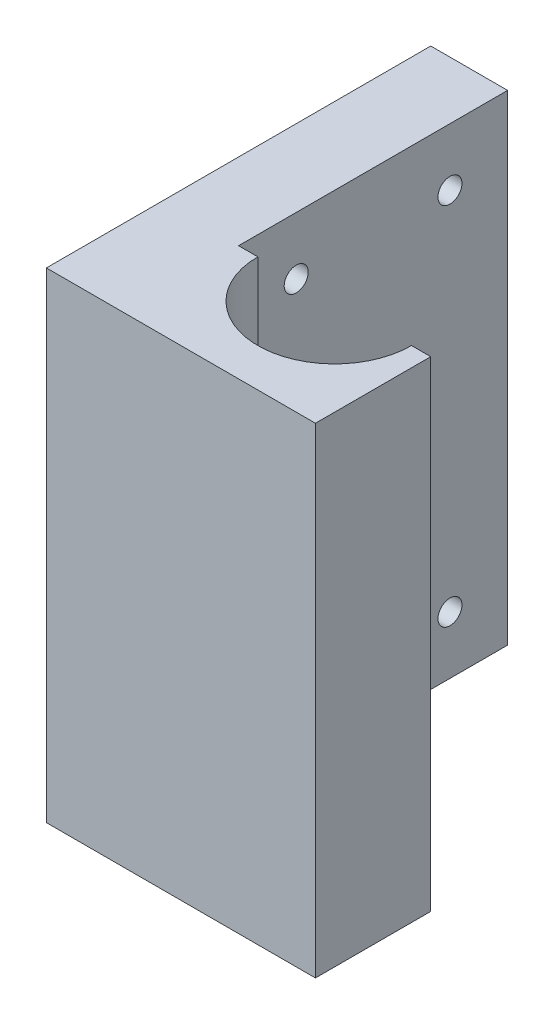
ISO-10303-21;
HEADER;
FILE_DESCRIPTION(('STEP AP214'),'2;1');
FILE_NAME('part.step','',(''),(''),'','','');
FILE_SCHEMA(('AUTOMOTIVE_DESIGN { 1 0 10303 214 1 1 1 1 }'));
ENDSEC;
DATA;
#1=APPLICATION_CONTEXT('core data for automotive mechanical design processes');
#2=APPLICATION_PROTOCOL_DEFINITION('international standard','automotive_design',2000,#1);
#3=PRODUCT_CONTEXT('',#1,'mechanical');
#4=PRODUCT('Part','Part','',(#3));
#5=PRODUCT_RELATED_PRODUCT_CATEGORY('part','',(#4));
#6=PRODUCT_DEFINITION_FORMATION('','',#4);
#7=PRODUCT_DEFINITION_CONTEXT('part definition',#1,'design');
#8=PRODUCT_DEFINITION('design','',#6,#7);
#9=PRODUCT_DEFINITION_SHAPE('','',#8);
#10=(LENGTH_UNIT() NAMED_UNIT(*) SI_UNIT(.MILLI.,.METRE.));
#11=(NAMED_UNIT(*) PLANE_ANGLE_UNIT() SI_UNIT($,.RADIAN.));
#12=(NAMED_UNIT(*) SI_UNIT($,.STERADIAN.) SOLID_ANGLE_UNIT());
#13=UNCERTAINTY_MEASURE_WITH_UNIT(LENGTH_MEASURE(1.E-05),#10,'distance_accuracy_value','');
#14=(GEOMETRIC_REPRESENTATION_CONTEXT(3) GLOBAL_UNCERTAINTY_ASSIGNED_CONTEXT((#13)) GLOBAL_UNIT_ASSIGNED_CONTEXT((#10,
#11,#12)) REPRESENTATION_CONTEXT('',''));
#15=CARTESIAN_POINT('',(0.,0.,0.));
#16=DIRECTION('',(0.,0.,1.));
#17=DIRECTION('',(1.,0.,0.));
#18=AXIS2_PLACEMENT_3D('',#15,#16,#17);
#19=CARTESIAN_POINT('',(2.,50.,0.));
#20=DIRECTION('',(0.,0.,1.));
#21=DIRECTION('',(1.,0.,0.));
#22=AXIS2_PLACEMENT_3D('',#19,#20,#21);
#23=PLANE('',#22);
#24=DIRECTION('',(-1.,0.,0.));
#25=VECTOR('',#24,1.);
#26=CARTESIAN_POINT('',(2.,0.,0.));
#27=LINE('',#26,#25);
#28=CARTESIAN_POINT('',(2.,0.,0.));
#29=VERTEX_POINT('',#28);
#30=CARTESIAN_POINT('',(0.,0.,0.));
#31=VERTEX_POINT('',#30);
#32=EDGE_CURVE('E144',#29,#31,#27,.T.);
#33=ORIENTED_EDGE('',*,*,#32,.T.);
#34=DIRECTION('',(0.,-1.,0.));
#35=VECTOR('',#34,1.);
#36=CARTESIAN_POINT('',(0.,50.,0.));
#37=LINE('',#36,#35);
#38=CARTESIAN_POINT('',(0.,50.,0.));
#39=VERTEX_POINT('',#38);
#40=EDGE_CURVE('E11',#39,#31,#37,.T.);
#41=ORIENTED_EDGE('',*,*,#40,.F.);
#42=DIRECTION('',(-1.,0.,0.));
#43=VECTOR('',#42,1.);
#44=CARTESIAN_POINT('',(2.,50.,0.));
#45=LINE('',#44,#43);
#46=CARTESIAN_POINT('',(2.,50.,0.));
#47=VERTEX_POINT('',#46);
#48=EDGE_CURVE('E167',#47,#39,#45,.T.);
#49=ORIENTED_EDGE('',*,*,#48,.F.);
#50=DIRECTION('',(0.,-1.,0.));
#51=VECTOR('',#50,1.);
#52=CARTESIAN_POINT('',(2.,50.,0.));
#53=LINE('',#52,#51);
#54=EDGE_CURVE('E140',#47,#29,#53,.T.);
#55=ORIENTED_EDGE('',*,*,#54,.T.);
#56=EDGE_LOOP('',(#33,#41,#49,#55));
#57=FACE_BOUND('',#56,.T.);
#58=ADVANCED_FACE('F43',(#57),#23,.F.);
#59=CARTESIAN_POINT('',(0.,50.,0.));
#60=DIRECTION('',(-1.,0.,0.));
#61=DIRECTION('',(0.,0.,1.));
#62=AXIS2_PLACEMENT_3D('',#59,#60,#61);
#63=PLANE('',#62);
#64=CARTESIAN_POINT('',(0.,44.,-22.));
#65=DIRECTION('',(1.,0.,0.));
#66=DIRECTION('',(0.,0.,-1.));
#67=AXIS2_PLACEMENT_3D('',#64,#65,#66);
#68=CIRCLE('',#67,1.24999999999999);
#69=CARTESIAN_POINT('',(0.,44.,-23.25));
#70=VERTEX_POINT('',#69);
#71=EDGE_CURVE('E238',#70,#70,#68,.T.);
#72=ORIENTED_EDGE('',*,*,#71,.F.);
#73=EDGE_LOOP('',(#72));
#74=FACE_BOUND('',#73,.T.);
#75=CARTESIAN_POINT('',(0.,44.,-6.));
#76=DIRECTION('',(1.,0.,0.));
#77=DIRECTION('',(0.,0.,-1.));
#78=AXIS2_PLACEMENT_3D('',#75,#76,#77);
#79=CIRCLE('',#78,1.24999999999999);
#80=CARTESIAN_POINT('',(0.,44.,-7.24999999999999));
#81=VERTEX_POINT('',#80);
#82=EDGE_CURVE('E230',#81,#81,#79,.T.);
#83=ORIENTED_EDGE('',*,*,#82,.F.);
#84=EDGE_LOOP('',(#83));
#85=FACE_BOUND('',#84,.T.);
#86=CARTESIAN_POINT('',(0.,6.,-6.));
#87=DIRECTION('',(1.,0.,0.));
#88=DIRECTION('',(0.,0.,-1.));
#89=AXIS2_PLACEMENT_3D('',#86,#87,#88);
#90=CIRCLE('',#89,1.24999999999999);
#91=CARTESIAN_POINT('',(0.,6.,-7.24999999999999));
#92=VERTEX_POINT('',#91);
#93=EDGE_CURVE('E222',#92,#92,#90,.T.);
#94=ORIENTED_EDGE('',*,*,#93,.F.);
#95=EDGE_LOOP('',(#94));
#96=FACE_BOUND('',#95,.T.);
#97=CARTESIAN_POINT('',(0.,6.,-22.));
#98=DIRECTION('',(1.,0.,0.));
#99=DIRECTION('',(0.,0.,-1.));
#100=AXIS2_PLACEMENT_3D('',#97,#98,#99);
#101=CIRCLE('',#100,1.24999999999999);
#102=CARTESIAN_POINT('',(0.,6.,-23.25));
#103=VERTEX_POINT('',#102);
#104=EDGE_CURVE('E214',#103,#103,#101,.T.);
#105=ORIENTED_EDGE('',*,*,#104,.F.);
#106=EDGE_LOOP('',(#105));
#107=FACE_BOUND('',#106,.T.);
#108=DIRECTION('',(0.,0.,-1.));
#109=VECTOR('',#108,1.);
#110=CARTESIAN_POINT('',(0.,0.,0.));
#111=LINE('',#110,#109);
#112=CARTESIAN_POINT('',(0.,0.,-28.));
#113=VERTEX_POINT('',#112);
#114=EDGE_CURVE('E148',#31,#113,#111,.T.);
#115=ORIENTED_EDGE('',*,*,#114,.T.);
#116=DIRECTION('',(0.,-1.,0.));
#117=VECTOR('',#116,1.);
#118=CARTESIAN_POINT('',(0.,50.,-28.));
#119=LINE('',#118,#117);
#120=CARTESIAN_POINT('',(0.,50.,-28.));
#121=VERTEX_POINT('',#120);
#122=EDGE_CURVE('E52',#121,#113,#119,.T.);
#123=ORIENTED_EDGE('',*,*,#122,.F.);
#124=DIRECTION('',(0.,0.,-1.));
#125=VECTOR('',#124,1.);
#126=CARTESIAN_POINT('',(0.,50.,0.));
#127=LINE('',#126,#125);
#128=EDGE_CURVE('E103',#39,#121,#127,.T.);
#129=ORIENTED_EDGE('',*,*,#128,.F.);
#130=ORIENTED_EDGE('',*,*,#40,.T.);
#131=EDGE_LOOP('',(#115,#123,#129,#130));
#132=FACE_BOUND('',#131,.T.);
#133=ADVANCED_FACE('F245',(#74,#85,#96,#107,#132),#63,.F.);
#134=CARTESIAN_POINT('',(0.,50.,-28.));
#135=DIRECTION('',(0.,0.,1.));
#136=DIRECTION('',(1.,0.,0.));
#137=AXIS2_PLACEMENT_3D('',#134,#135,#136);
#138=PLANE('',#137);
#139=DIRECTION('',(-1.,0.,0.));
#140=VECTOR('',#139,1.);
#141=CARTESIAN_POINT('',(0.,0.,-28.));
#142=LINE('',#141,#140);
#143=CARTESIAN_POINT('',(-8.00000000000001,0.,-28.));
#144=VERTEX_POINT('',#143);
#145=EDGE_CURVE('E152',#113,#144,#142,.T.);
#146=ORIENTED_EDGE('',*,*,#145,.T.);
#147=DIRECTION('',(0.,-1.,0.));
#148=VECTOR('',#147,1.);
#149=CARTESIAN_POINT('',(-8.00000000000001,50.,-28.));
#150=LINE('',#149,#148);
#151=CARTESIAN_POINT('',(-8.00000000000001,50.,-28.));
#152=VERTEX_POINT('',#151);
#153=EDGE_CURVE('E178',#152,#144,#150,.T.);
#154=ORIENTED_EDGE('',*,*,#153,.F.);
#155=DIRECTION('',(-1.,0.,0.));
#156=VECTOR('',#155,1.);
#157=CARTESIAN_POINT('',(0.,50.,-28.));
#158=LINE('',#157,#156);
#159=EDGE_CURVE('E188',#121,#152,#158,.T.);
#160=ORIENTED_EDGE('',*,*,#159,.F.);
#161=ORIENTED_EDGE('',*,*,#122,.T.);
#162=EDGE_LOOP('',(#146,#154,#160,#161));
#163=FACE_BOUND('',#162,.T.);
#164=ADVANCED_FACE('F186',(#163),#138,.F.);
#165=CARTESIAN_POINT('',(-8.00000000000001,50.,-28.));
#166=DIRECTION('',(1.,0.,0.));
#167=DIRECTION('',(0.,0.,-1.));
#168=AXIS2_PLACEMENT_3D('',#165,#166,#167);
#169=PLANE('',#168);
#170=CARTESIAN_POINT('',(-8.00000000000001,44.,-22.));
#171=DIRECTION('',(1.,0.,0.));
#172=DIRECTION('',(0.,0.,-1.));
#173=AXIS2_PLACEMENT_3D('',#170,#171,#172);
#174=CIRCLE('',#173,1.25);
#175=CARTESIAN_POINT('',(-8.00000000000001,44.,-23.25));
#176=VERTEX_POINT('',#175);
#177=EDGE_CURVE('E234',#176,#176,#174,.T.);
#178=ORIENTED_EDGE('',*,*,#177,.T.);
#179=EDGE_LOOP('',(#178));
#180=FACE_BOUND('',#179,.T.);
#181=CARTESIAN_POINT('',(-8.00000000000001,44.,-6.));
#182=DIRECTION('',(1.,0.,0.));
#183=DIRECTION('',(0.,0.,-1.));
#184=AXIS2_PLACEMENT_3D('',#181,#182,#183);
#185=CIRCLE('',#184,1.25);
#186=CARTESIAN_POINT('',(-8.00000000000001,44.,-7.25));
#187=VERTEX_POINT('',#186);
#188=EDGE_CURVE('E226',#187,#187,#185,.T.);
#189=ORIENTED_EDGE('',*,*,#188,.T.);
#190=EDGE_LOOP('',(#189));
#191=FACE_BOUND('',#190,.T.);
#192=CARTESIAN_POINT('',(-8.00000000000001,6.,-6.));
#193=DIRECTION('',(1.,0.,0.));
#194=DIRECTION('',(0.,0.,-1.));
#195=AXIS2_PLACEMENT_3D('',#192,#193,#194);
#196=CIRCLE('',#195,1.25);
#197=CARTESIAN_POINT('',(-8.00000000000001,6.,-7.25));
#198=VERTEX_POINT('',#197);
#199=EDGE_CURVE('E218',#198,#198,#196,.T.);
#200=ORIENTED_EDGE('',*,*,#199,.T.);
#201=EDGE_LOOP('',(#200));
#202=FACE_BOUND('',#201,.T.);
#203=CARTESIAN_POINT('',(-8.00000000000001,6.,-22.));
#204=DIRECTION('',(1.,0.,0.));
#205=DIRECTION('',(0.,0.,-1.));
#206=AXIS2_PLACEMENT_3D('',#203,#204,#205);
#207=CIRCLE('',#206,1.25);
#208=CARTESIAN_POINT('',(-8.00000000000001,6.,-23.25));
#209=VERTEX_POINT('',#208);
#210=EDGE_CURVE('E149',#209,#209,#207,.T.);
#211=ORIENTED_EDGE('',*,*,#210,.T.);
#212=EDGE_LOOP('',(#211));
#213=FACE_BOUND('',#212,.T.);
#214=DIRECTION('',(0.,0.,1.));
#215=VECTOR('',#214,1.);
#216=CARTESIAN_POINT('',(-8.00000000000001,0.,-28.));
#217=LINE('',#216,#215);
#218=CARTESIAN_POINT('',(-8.,0.,12.));
#219=VERTEX_POINT('',#218);
#220=EDGE_CURVE('E155',#144,#219,#217,.T.);
#221=ORIENTED_EDGE('',*,*,#220,.T.);
#222=DIRECTION('',(0.,-1.,0.));
#223=VECTOR('',#222,1.);
#224=CARTESIAN_POINT('',(-8.,50.,12.));
#225=LINE('',#224,#223);
#226=CARTESIAN_POINT('',(-8.,50.,12.));
#227=VERTEX_POINT('',#226);
#228=EDGE_CURVE('E174',#227,#219,#225,.T.);
#229=ORIENTED_EDGE('',*,*,#228,.F.);
#230=DIRECTION('',(0.,0.,1.));
#231=VECTOR('',#230,1.);
#232=CARTESIAN_POINT('',(-8.00000000000001,50.,-28.));
#233=LINE('',#232,#231);
#234=EDGE_CURVE('E201',#152,#227,#233,.T.);
#235=ORIENTED_EDGE('',*,*,#234,.F.);
#236=ORIENTED_EDGE('',*,*,#153,.T.);
#237=EDGE_LOOP('',(#221,#229,#235,#236));
#238=FACE_BOUND('',#237,.T.);
#239=ADVANCED_FACE('F196',(#180,#191,#202,#213,#238),#169,.F.);
#240=CARTESIAN_POINT('',(-8.,50.,12.));
#241=DIRECTION('',(0.,0.,-1.));
#242=DIRECTION('',(-1.,0.,0.));
#243=AXIS2_PLACEMENT_3D('',#240,#241,#242);
#244=PLANE('',#243);
#245=DIRECTION('',(1.,0.,0.));
#246=VECTOR('',#245,1.);
#247=CARTESIAN_POINT('',(-8.,0.,12.));
#248=LINE('',#247,#246);
#249=CARTESIAN_POINT('',(20.,0.,12.));
#250=VERTEX_POINT('',#249);
#251=EDGE_CURVE('E158',#219,#250,#248,.T.);
#252=ORIENTED_EDGE('',*,*,#251,.T.);
#253=DIRECTION('',(0.,-1.,0.));
#254=VECTOR('',#253,1.);
#255=CARTESIAN_POINT('',(20.,50.,12.));
#256=LINE('',#255,#254);
#257=CARTESIAN_POINT('',(20.,50.,12.));
#258=VERTEX_POINT('',#257);
#259=EDGE_CURVE('E133',#258,#250,#256,.T.);
#260=ORIENTED_EDGE('',*,*,#259,.F.);
#261=DIRECTION('',(1.,0.,0.));
#262=VECTOR('',#261,1.);
#263=CARTESIAN_POINT('',(-8.,50.,12.));
#264=LINE('',#263,#262);
#265=EDGE_CURVE('E122',#227,#258,#264,.T.);
#266=ORIENTED_EDGE('',*,*,#265,.F.);
#267=ORIENTED_EDGE('',*,*,#228,.T.);
#268=EDGE_LOOP('',(#252,#260,#266,#267));
#269=FACE_BOUND('',#268,.T.);
#270=ADVANCED_FACE('F199',(#269),#244,.F.);
#271=CARTESIAN_POINT('',(20.,50.,12.));
#272=DIRECTION('',(-1.,0.,0.));
#273=DIRECTION('',(0.,0.,1.));
#274=AXIS2_PLACEMENT_3D('',#271,#272,#273);
#275=PLANE('',#274);
#276=DIRECTION('',(0.,0.,-1.));
#277=VECTOR('',#276,1.);
#278=CARTESIAN_POINT('',(20.,0.,12.));
#279=LINE('',#278,#277);
#280=CARTESIAN_POINT('',(20.,0.,0.));
#281=VERTEX_POINT('',#280);
#282=EDGE_CURVE('E131',#250,#281,#279,.T.);
#283=ORIENTED_EDGE('',*,*,#282,.T.);
#284=DIRECTION('',(0.,-1.,0.));
#285=VECTOR('',#284,1.);
#286=CARTESIAN_POINT('',(20.,50.,0.));
#287=LINE('',#286,#285);
#288=CARTESIAN_POINT('',(20.,50.,0.));
#289=VERTEX_POINT('',#288);
#290=EDGE_CURVE('E128',#289,#281,#287,.T.);
#291=ORIENTED_EDGE('',*,*,#290,.F.);
#292=DIRECTION('',(0.,0.,-1.));
#293=VECTOR('',#292,1.);
#294=CARTESIAN_POINT('',(20.,50.,12.));
#295=LINE('',#294,#293);
#296=EDGE_CURVE('E116',#258,#289,#295,.T.);
#297=ORIENTED_EDGE('',*,*,#296,.F.);
#298=ORIENTED_EDGE('',*,*,#259,.T.);
#299=EDGE_LOOP('',(#283,#291,#297,#298));
#300=FACE_BOUND('',#299,.T.);
#301=ADVANCED_FACE('F129',(#300),#275,.F.);
#302=CARTESIAN_POINT('',(20.,50.,0.));
#303=DIRECTION('',(0.,0.,1.));
#304=DIRECTION('',(1.,0.,0.));
#305=AXIS2_PLACEMENT_3D('',#302,#303,#304);
#306=PLANE('',#305);
#307=DIRECTION('',(-1.,0.,0.));
#308=VECTOR('',#307,1.);
#309=CARTESIAN_POINT('',(20.,0.,0.));
#310=LINE('',#309,#308);
#311=CARTESIAN_POINT('',(18.,0.,0.));
#312=VERTEX_POINT('',#311);
#313=EDGE_CURVE('E89',#281,#312,#310,.T.);
#314=ORIENTED_EDGE('',*,*,#313,.T.);
#315=DIRECTION('',(0.,-1.,0.));
#316=VECTOR('',#315,1.);
#317=CARTESIAN_POINT('',(18.,50.,0.));
#318=LINE('',#317,#316);
#319=CARTESIAN_POINT('',(18.,50.,0.));
#320=VERTEX_POINT('',#319);
#321=EDGE_CURVE('E134',#320,#312,#318,.T.);
#322=ORIENTED_EDGE('',*,*,#321,.F.);
#323=DIRECTION('',(-1.,0.,0.));
#324=VECTOR('',#323,1.);
#325=CARTESIAN_POINT('',(20.,50.,0.));
#326=LINE('',#325,#324);
#327=EDGE_CURVE('E120',#289,#320,#326,.T.);
#328=ORIENTED_EDGE('',*,*,#327,.F.);
#329=ORIENTED_EDGE('',*,*,#290,.T.);
#330=EDGE_LOOP('',(#314,#322,#328,#329));
#331=FACE_BOUND('',#330,.T.);
#332=ADVANCED_FACE('F136',(#331),#306,.F.);
#333=CARTESIAN_POINT('',(10.,50.,0.));
#334=DIRECTION('',(0.,-1.,0.));
#335=DIRECTION('',(0.,0.,-1.));
#336=AXIS2_PLACEMENT_3D('',#333,#334,#335);
#337=CYLINDRICAL_SURFACE('',#336,8.);
#338=CARTESIAN_POINT('',(10.,0.,0.));
#339=DIRECTION('',(0.,-1.,0.));
#340=DIRECTION('',(0.,0.,1.));
#341=AXIS2_PLACEMENT_3D('',#338,#339,#340);
#342=CIRCLE('',#341,8.);
#343=EDGE_CURVE('E95',#312,#29,#342,.T.);
#344=ORIENTED_EDGE('',*,*,#343,.T.);
#345=ORIENTED_EDGE('',*,*,#54,.F.);
#346=CARTESIAN_POINT('',(10.,50.,0.));
#347=DIRECTION('',(0.,-1.,0.));
#348=DIRECTION('',(0.,0.,1.));
#349=AXIS2_PLACEMENT_3D('',#346,#347,#348);
#350=CIRCLE('',#349,8.);
#351=EDGE_CURVE('E60',#320,#47,#350,.T.);
#352=ORIENTED_EDGE('',*,*,#351,.F.);
#353=ORIENTED_EDGE('',*,*,#321,.T.);
#354=EDGE_LOOP('',(#344,#345,#352,#353));
#355=FACE_BOUND('',#354,.T.);
#356=ADVANCED_FACE('F256',(#355),#337,.F.);
#357=CARTESIAN_POINT('',(10.,50.,0.));
#358=DIRECTION('',(0.,1.,0.));
#359=DIRECTION('',(0.,0.,1.));
#360=AXIS2_PLACEMENT_3D('',#357,#358,#359);
#361=PLANE('',#360);
#362=ORIENTED_EDGE('',*,*,#48,.T.);
#363=ORIENTED_EDGE('',*,*,#128,.T.);
#364=ORIENTED_EDGE('',*,*,#159,.T.);
#365=ORIENTED_EDGE('',*,*,#234,.T.);
#366=ORIENTED_EDGE('',*,*,#265,.T.);
#367=ORIENTED_EDGE('',*,*,#296,.T.);
#368=ORIENTED_EDGE('',*,*,#327,.T.);
#369=ORIENTED_EDGE('',*,*,#351,.T.);
#370=EDGE_LOOP('',(#362,#363,#364,#365,#366,#367,#368,#369));
#371=FACE_BOUND('',#370,.T.);
#372=ADVANCED_FACE('F118',(#371),#361,.T.);
#373=CARTESIAN_POINT('',(10.,0.,0.));
#374=DIRECTION('',(0.,1.,0.));
#375=DIRECTION('',(0.,0.,1.));
#376=AXIS2_PLACEMENT_3D('',#373,#374,#375);
#377=PLANE('',#376);
#378=ORIENTED_EDGE('',*,*,#32,.F.);
#379=ORIENTED_EDGE('',*,*,#343,.F.);
#380=ORIENTED_EDGE('',*,*,#313,.F.);
#381=ORIENTED_EDGE('',*,*,#282,.F.);
#382=ORIENTED_EDGE('',*,*,#251,.F.);
#383=ORIENTED_EDGE('',*,*,#220,.F.);
#384=ORIENTED_EDGE('',*,*,#145,.F.);
#385=ORIENTED_EDGE('',*,*,#114,.F.);
#386=EDGE_LOOP('',(#378,#379,#380,#381,#382,#383,#384,#385));
#387=FACE_BOUND('',#386,.T.);
#388=ADVANCED_FACE('F192',(#387),#377,.F.);
#389=CARTESIAN_POINT('',(0.,6.,-22.));
#390=DIRECTION('',(1.,0.,0.));
#391=DIRECTION('',(0.,0.,-1.));
#392=AXIS2_PLACEMENT_3D('',#389,#390,#391);
#393=CYLINDRICAL_SURFACE('',#392,1.24999999999999);
#394=ORIENTED_EDGE('',*,*,#210,.F.);
#395=EDGE_LOOP('',(#394));
#396=FACE_BOUND('',#395,.T.);
#397=ORIENTED_EDGE('',*,*,#104,.T.);
#398=EDGE_LOOP('',(#397));
#399=FACE_BOUND('',#398,.T.);
#400=ADVANCED_FACE('F323',(#396,#399),#393,.F.);
#401=CARTESIAN_POINT('',(0.,6.,-6.));
#402=DIRECTION('',(1.,0.,0.));
#403=DIRECTION('',(0.,0.,-1.));
#404=AXIS2_PLACEMENT_3D('',#401,#402,#403);
#405=CYLINDRICAL_SURFACE('',#404,1.24999999999999);
#406=ORIENTED_EDGE('',*,*,#199,.F.);
#407=EDGE_LOOP('',(#406));
#408=FACE_BOUND('',#407,.T.);
#409=ORIENTED_EDGE('',*,*,#93,.T.);
#410=EDGE_LOOP('',(#409));
#411=FACE_BOUND('',#410,.T.);
#412=ADVANCED_FACE('F342',(#408,#411),#405,.F.);
#413=CARTESIAN_POINT('',(0.,44.,-6.));
#414=DIRECTION('',(1.,0.,0.));
#415=DIRECTION('',(0.,0.,-1.));
#416=AXIS2_PLACEMENT_3D('',#413,#414,#415);
#417=CYLINDRICAL_SURFACE('',#416,1.24999999999999);
#418=ORIENTED_EDGE('',*,*,#188,.F.);
#419=EDGE_LOOP('',(#418));
#420=FACE_BOUND('',#419,.T.);
#421=ORIENTED_EDGE('',*,*,#82,.T.);
#422=EDGE_LOOP('',(#421));
#423=FACE_BOUND('',#422,.T.);
#424=ADVANCED_FACE('F346',(#420,#423),#417,.F.);
#425=CARTESIAN_POINT('',(0.,44.,-22.));
#426=DIRECTION('',(1.,0.,0.));
#427=DIRECTION('',(0.,0.,-1.));
#428=AXIS2_PLACEMENT_3D('',#425,#426,#427);
#429=CYLINDRICAL_SURFACE('',#428,1.24999999999999);
#430=ORIENTED_EDGE('',*,*,#177,.F.);
#431=EDGE_LOOP('',(#430));
#432=FACE_BOUND('',#431,.T.);
#433=ORIENTED_EDGE('',*,*,#71,.T.);
#434=EDGE_LOOP('',(#433));
#435=FACE_BOUND('',#434,.T.);
#436=ADVANCED_FACE('F243',(#432,#435),#429,.F.);
#437=CLOSED_SHELL('',(#58,#133,#164,#239,#270,#301,#332,#356,#372,#388,#400,#412,#424,#436));
#438=MANIFOLD_SOLID_BREP('B2',#437);
#439=ADVANCED_BREP_SHAPE_REPRESENTATION('',(#18,#438),#14);
#440=SHAPE_DEFINITION_REPRESENTATION(#9,#439);
ENDSEC;
END-ISO-10303-21;
